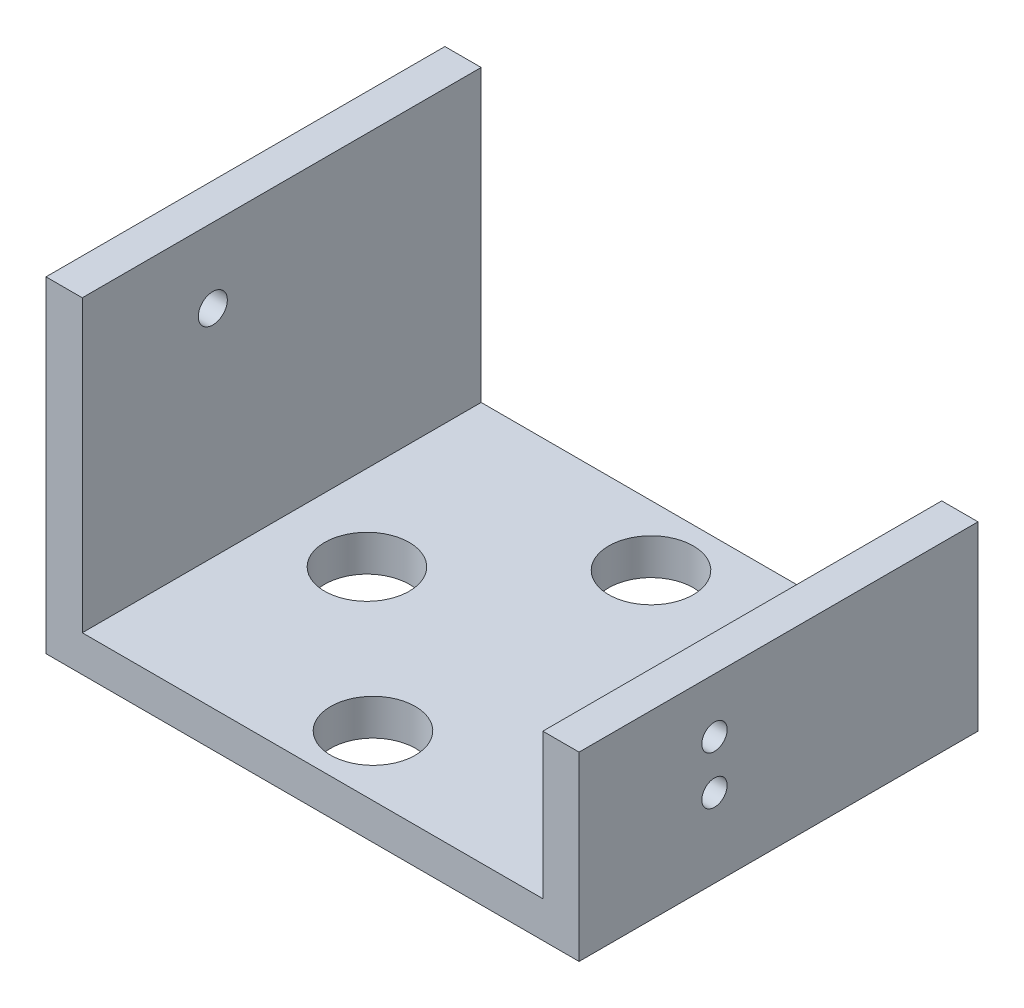
ISO-10303-21;
HEADER;
FILE_DESCRIPTION(('STEP AP214'),'2;1');
FILE_NAME('part.step','',(''),(''),'','','');
FILE_SCHEMA(('AUTOMOTIVE_DESIGN { 1 0 10303 214 1 1 1 1 }'));
ENDSEC;
DATA;
#1=APPLICATION_CONTEXT('core data for automotive mechanical design processes');
#2=APPLICATION_PROTOCOL_DEFINITION('international standard','automotive_design',2000,#1);
#3=PRODUCT_CONTEXT('',#1,'mechanical');
#4=PRODUCT('Part','Part','',(#3));
#5=PRODUCT_RELATED_PRODUCT_CATEGORY('part','',(#4));
#6=PRODUCT_DEFINITION_FORMATION('','',#4);
#7=PRODUCT_DEFINITION_CONTEXT('part definition',#1,'design');
#8=PRODUCT_DEFINITION('design','',#6,#7);
#9=PRODUCT_DEFINITION_SHAPE('','',#8);
#10=(LENGTH_UNIT() NAMED_UNIT(*) SI_UNIT(.MILLI.,.METRE.));
#11=(NAMED_UNIT(*) PLANE_ANGLE_UNIT() SI_UNIT($,.RADIAN.));
#12=(NAMED_UNIT(*) SI_UNIT($,.STERADIAN.) SOLID_ANGLE_UNIT());
#13=UNCERTAINTY_MEASURE_WITH_UNIT(LENGTH_MEASURE(1.E-05),#10,'distance_accuracy_value','');
#14=(GEOMETRIC_REPRESENTATION_CONTEXT(3) GLOBAL_UNCERTAINTY_ASSIGNED_CONTEXT((#13)) GLOBAL_UNIT_ASSIGNED_CONTEXT((#10,
#11,#12)) REPRESENTATION_CONTEXT('',''));
#15=CARTESIAN_POINT('',(0.,0.,0.));
#16=DIRECTION('',(0.,0.,1.));
#17=DIRECTION('',(1.,0.,0.));
#18=AXIS2_PLACEMENT_3D('',#15,#16,#17);
#19=CARTESIAN_POINT('',(0.,3.,0.));
#20=DIRECTION('',(0.,-1.,0.));
#21=DIRECTION('',(0.,0.,-1.));
#22=AXIS2_PLACEMENT_3D('',#19,#20,#21);
#23=PLANE('',#22);
#24=CARTESIAN_POINT('',(-12.,3.,0.));
#25=DIRECTION('',(0.,-1.,0.));
#26=DIRECTION('',(0.,0.,-1.));
#27=AXIS2_PLACEMENT_3D('',#24,#25,#26);
#28=CIRCLE('',#27,3.5);
#29=CARTESIAN_POINT('',(-12.,3.,-3.5));
#30=VERTEX_POINT('',#29);
#31=EDGE_CURVE('E178',#30,#30,#28,.T.);
#32=ORIENTED_EDGE('',*,*,#31,.T.);
#33=EDGE_LOOP('',(#32));
#34=FACE_BOUND('',#33,.T.);
#35=CARTESIAN_POINT('',(0.,3.,-11.5));
#36=DIRECTION('',(0.,-1.,0.));
#37=DIRECTION('',(0.,0.,-1.));
#38=AXIS2_PLACEMENT_3D('',#35,#36,#37);
#39=CIRCLE('',#38,3.5);
#40=CARTESIAN_POINT('',(0.,3.,-15.));
#41=VERTEX_POINT('',#40);
#42=EDGE_CURVE('E273',#41,#41,#39,.T.);
#43=ORIENTED_EDGE('',*,*,#42,.T.);
#44=EDGE_LOOP('',(#43));
#45=FACE_BOUND('',#44,.T.);
#46=CARTESIAN_POINT('',(12.,3.,0.));
#47=DIRECTION('',(0.,-1.,0.));
#48=DIRECTION('',(0.,0.,-1.));
#49=AXIS2_PLACEMENT_3D('',#46,#47,#48);
#50=CIRCLE('',#49,3.5);
#51=CARTESIAN_POINT('',(12.,3.,-3.5));
#52=VERTEX_POINT('',#51);
#53=EDGE_CURVE('E268',#52,#52,#50,.T.);
#54=ORIENTED_EDGE('',*,*,#53,.T.);
#55=EDGE_LOOP('',(#54));
#56=FACE_BOUND('',#55,.T.);
#57=CARTESIAN_POINT('',(0.,3.,11.5));
#58=DIRECTION('',(0.,-1.,0.));
#59=DIRECTION('',(0.,0.,-1.));
#60=AXIS2_PLACEMENT_3D('',#57,#58,#59);
#61=CIRCLE('',#60,3.5);
#62=CARTESIAN_POINT('',(0.,3.,8.));
#63=VERTEX_POINT('',#62);
#64=EDGE_CURVE('E265',#63,#63,#61,.T.);
#65=ORIENTED_EDGE('',*,*,#64,.T.);
#66=EDGE_LOOP('',(#65));
#67=FACE_BOUND('',#66,.T.);
#68=DIRECTION('',(0.,0.,1.));
#69=VECTOR('',#68,1.);
#70=CARTESIAN_POINT('',(19.05,3.,16.5));
#71=LINE('',#70,#69);
#72=CARTESIAN_POINT('',(19.05,3.,-16.5));
#73=VERTEX_POINT('',#72);
#74=CARTESIAN_POINT('',(19.05,3.,16.5));
#75=VERTEX_POINT('',#74);
#76=EDGE_CURVE('E196',#73,#75,#71,.T.);
#77=ORIENTED_EDGE('',*,*,#76,.F.);
#78=DIRECTION('',(-1.,0.,0.));
#79=VECTOR('',#78,1.);
#80=CARTESIAN_POINT('',(-22.05,3.,-16.5));
#81=LINE('',#80,#79);
#82=CARTESIAN_POINT('',(-19.05,3.,-16.5));
#83=VERTEX_POINT('',#82);
#84=EDGE_CURVE('E149',#73,#83,#81,.T.);
#85=ORIENTED_EDGE('',*,*,#84,.T.);
#86=DIRECTION('',(0.,0.,-1.));
#87=VECTOR('',#86,1.);
#88=CARTESIAN_POINT('',(-19.05,3.,-16.5));
#89=LINE('',#88,#87);
#90=CARTESIAN_POINT('',(-19.05,3.,16.5));
#91=VERTEX_POINT('',#90);
#92=EDGE_CURVE('E199',#91,#83,#89,.T.);
#93=ORIENTED_EDGE('',*,*,#92,.F.);
#94=DIRECTION('',(1.,0.,0.));
#95=VECTOR('',#94,1.);
#96=CARTESIAN_POINT('',(-22.05,3.,16.5));
#97=LINE('',#96,#95);
#98=EDGE_CURVE('E139',#91,#75,#97,.T.);
#99=ORIENTED_EDGE('',*,*,#98,.T.);
#100=EDGE_LOOP('',(#77,#85,#93,#99));
#101=FACE_BOUND('',#100,.T.);
#102=ADVANCED_FACE('F49',(#34,#45,#56,#67,#101),#23,.F.);
#103=CARTESIAN_POINT('',(22.05,3.,16.5));
#104=DIRECTION('',(-1.,0.,0.));
#105=DIRECTION('',(0.,0.,1.));
#106=AXIS2_PLACEMENT_3D('',#103,#104,#105);
#107=PLANE('',#106);
#108=CARTESIAN_POINT('',(22.05,10.5,5.3));
#109=DIRECTION('',(1.,0.,0.));
#110=DIRECTION('',(0.,0.,-1.));
#111=AXIS2_PLACEMENT_3D('',#108,#109,#110);
#112=CIRCLE('',#111,1.05);
#113=CARTESIAN_POINT('',(22.05,10.5,4.25));
#114=VERTEX_POINT('',#113);
#115=EDGE_CURVE('E160',#114,#114,#112,.T.);
#116=ORIENTED_EDGE('',*,*,#115,.F.);
#117=EDGE_LOOP('',(#116));
#118=FACE_BOUND('',#117,.T.);
#119=CARTESIAN_POINT('',(22.05,6.5,5.3));
#120=DIRECTION('',(1.,0.,0.));
#121=DIRECTION('',(0.,0.,-1.));
#122=AXIS2_PLACEMENT_3D('',#119,#120,#121);
#123=CIRCLE('',#122,1.05);
#124=CARTESIAN_POINT('',(22.05,6.5,4.25));
#125=VERTEX_POINT('',#124);
#126=EDGE_CURVE('E170',#125,#125,#123,.T.);
#127=ORIENTED_EDGE('',*,*,#126,.F.);
#128=EDGE_LOOP('',(#127));
#129=FACE_BOUND('',#128,.T.);
#130=DIRECTION('',(0.,-1.,0.));
#131=VECTOR('',#130,1.);
#132=CARTESIAN_POINT('',(22.05,3.,-16.5));
#133=LINE('',#132,#131);
#134=CARTESIAN_POINT('',(22.05,15.,-16.5));
#135=VERTEX_POINT('',#134);
#136=CARTESIAN_POINT('',(22.05,0.,-16.5));
#137=VERTEX_POINT('',#136);
#138=EDGE_CURVE('E59',#135,#137,#133,.T.);
#139=ORIENTED_EDGE('',*,*,#138,.F.);
#140=DIRECTION('',(0.,0.,-1.));
#141=VECTOR('',#140,1.);
#142=CARTESIAN_POINT('',(22.05,15.,16.5));
#143=LINE('',#142,#141);
#144=CARTESIAN_POINT('',(22.05,15.,16.5));
#145=VERTEX_POINT('',#144);
#146=EDGE_CURVE('E118',#145,#135,#143,.T.);
#147=ORIENTED_EDGE('',*,*,#146,.F.);
#148=DIRECTION('',(0.,-1.,0.));
#149=VECTOR('',#148,1.);
#150=CARTESIAN_POINT('',(22.05,3.,16.5));
#151=LINE('',#150,#149);
#152=CARTESIAN_POINT('',(22.05,0.,16.5));
#153=VERTEX_POINT('',#152);
#154=EDGE_CURVE('E127',#145,#153,#151,.T.);
#155=ORIENTED_EDGE('',*,*,#154,.T.);
#156=DIRECTION('',(0.,0.,-1.));
#157=VECTOR('',#156,1.);
#158=CARTESIAN_POINT('',(22.05,0.,16.5));
#159=LINE('',#158,#157);
#160=EDGE_CURVE('E225',#153,#137,#159,.T.);
#161=ORIENTED_EDGE('',*,*,#160,.T.);
#162=EDGE_LOOP('',(#139,#147,#155,#161));
#163=FACE_BOUND('',#162,.T.);
#164=ADVANCED_FACE('F51',(#118,#129,#163),#107,.F.);
#165=CARTESIAN_POINT('',(-22.05,3.,-16.5));
#166=DIRECTION('',(0.,0.,1.));
#167=DIRECTION('',(1.,0.,0.));
#168=AXIS2_PLACEMENT_3D('',#165,#166,#167);
#169=PLANE('',#168);
#170=DIRECTION('',(0.,-1.,0.));
#171=VECTOR('',#170,1.);
#172=CARTESIAN_POINT('',(19.05,27.,-16.5));
#173=LINE('',#172,#171);
#174=CARTESIAN_POINT('',(19.05,15.,-16.5));
#175=VERTEX_POINT('',#174);
#176=EDGE_CURVE('E73',#175,#73,#173,.T.);
#177=ORIENTED_EDGE('',*,*,#176,.F.);
#178=DIRECTION('',(1.,0.,0.));
#179=VECTOR('',#178,1.);
#180=CARTESIAN_POINT('',(-1.95,15.,-16.5));
#181=LINE('',#180,#179);
#182=EDGE_CURVE('E67',#175,#135,#181,.T.);
#183=ORIENTED_EDGE('',*,*,#182,.T.);
#184=ORIENTED_EDGE('',*,*,#138,.T.);
#185=DIRECTION('',(-1.,0.,0.));
#186=VECTOR('',#185,1.);
#187=CARTESIAN_POINT('',(-22.05,0.,-16.5));
#188=LINE('',#187,#186);
#189=CARTESIAN_POINT('',(-22.05,0.,-16.5));
#190=VERTEX_POINT('',#189);
#191=EDGE_CURVE('E229',#137,#190,#188,.T.);
#192=ORIENTED_EDGE('',*,*,#191,.T.);
#193=DIRECTION('',(0.,-1.,0.));
#194=VECTOR('',#193,1.);
#195=CARTESIAN_POINT('',(-22.05,3.,-16.5));
#196=LINE('',#195,#194);
#197=CARTESIAN_POINT('',(-22.05,27.,-16.5));
#198=VERTEX_POINT('',#197);
#199=EDGE_CURVE('E145',#198,#190,#196,.T.);
#200=ORIENTED_EDGE('',*,*,#199,.F.);
#201=DIRECTION('',(-1.,0.,0.));
#202=VECTOR('',#201,1.);
#203=CARTESIAN_POINT('',(-22.05,27.,-16.5));
#204=LINE('',#203,#202);
#205=CARTESIAN_POINT('',(-19.05,27.,-16.5));
#206=VERTEX_POINT('',#205);
#207=EDGE_CURVE('E210',#206,#198,#204,.T.);
#208=ORIENTED_EDGE('',*,*,#207,.F.);
#209=DIRECTION('',(0.,-1.,0.));
#210=VECTOR('',#209,1.);
#211=CARTESIAN_POINT('',(-19.05,27.,-16.5));
#212=LINE('',#211,#210);
#213=EDGE_CURVE('E214',#206,#83,#212,.T.);
#214=ORIENTED_EDGE('',*,*,#213,.T.);
#215=ORIENTED_EDGE('',*,*,#84,.F.);
#216=EDGE_LOOP('',(#177,#183,#184,#192,#200,#208,#214,#215));
#217=FACE_BOUND('',#216,.T.);
#218=ADVANCED_FACE('F315',(#217),#169,.F.);
#219=CARTESIAN_POINT('',(-22.05,3.,16.5));
#220=DIRECTION('',(1.,0.,0.));
#221=DIRECTION('',(0.,0.,-1.));
#222=AXIS2_PLACEMENT_3D('',#219,#220,#221);
#223=PLANE('',#222);
#224=CARTESIAN_POINT('',(-22.05,20.85,5.7));
#225=DIRECTION('',(1.,0.,0.));
#226=DIRECTION('',(0.,0.,-1.));
#227=AXIS2_PLACEMENT_3D('',#224,#225,#226);
#228=CIRCLE('',#227,1.2);
#229=CARTESIAN_POINT('',(-22.05,20.85,4.5));
#230=VERTEX_POINT('',#229);
#231=EDGE_CURVE('E130',#230,#230,#228,.T.);
#232=ORIENTED_EDGE('',*,*,#231,.T.);
#233=EDGE_LOOP('',(#232));
#234=FACE_BOUND('',#233,.T.);
#235=DIRECTION('',(0.,0.,1.));
#236=VECTOR('',#235,1.);
#237=CARTESIAN_POINT('',(-22.05,0.,16.5));
#238=LINE('',#237,#236);
#239=CARTESIAN_POINT('',(-22.05,0.,16.5));
#240=VERTEX_POINT('',#239);
#241=EDGE_CURVE('E230',#190,#240,#238,.T.);
#242=ORIENTED_EDGE('',*,*,#241,.T.);
#243=DIRECTION('',(0.,-1.,0.));
#244=VECTOR('',#243,1.);
#245=CARTESIAN_POINT('',(-22.05,3.,16.5));
#246=LINE('',#245,#244);
#247=CARTESIAN_POINT('',(-22.05,27.,16.5));
#248=VERTEX_POINT('',#247);
#249=EDGE_CURVE('E138',#248,#240,#246,.T.);
#250=ORIENTED_EDGE('',*,*,#249,.F.);
#251=DIRECTION('',(0.,0.,1.));
#252=VECTOR('',#251,1.);
#253=CARTESIAN_POINT('',(-22.05,27.,-16.5));
#254=LINE('',#253,#252);
#255=EDGE_CURVE('E200',#198,#248,#254,.T.);
#256=ORIENTED_EDGE('',*,*,#255,.F.);
#257=ORIENTED_EDGE('',*,*,#199,.T.);
#258=EDGE_LOOP('',(#242,#250,#256,#257));
#259=FACE_BOUND('',#258,.T.);
#260=ADVANCED_FACE('F318',(#234,#259),#223,.F.);
#261=CARTESIAN_POINT('',(-22.05,3.,16.5));
#262=DIRECTION('',(0.,0.,-1.));
#263=DIRECTION('',(-1.,0.,0.));
#264=AXIS2_PLACEMENT_3D('',#261,#262,#263);
#265=PLANE('',#264);
#266=ORIENTED_EDGE('',*,*,#154,.F.);
#267=DIRECTION('',(1.,0.,0.));
#268=VECTOR('',#267,1.);
#269=CARTESIAN_POINT('',(-1.95,15.,16.5));
#270=LINE('',#269,#268);
#271=CARTESIAN_POINT('',(19.05,15.,16.5));
#272=VERTEX_POINT('',#271);
#273=EDGE_CURVE('E115',#272,#145,#270,.T.);
#274=ORIENTED_EDGE('',*,*,#273,.F.);
#275=DIRECTION('',(0.,-1.,0.));
#276=VECTOR('',#275,1.);
#277=CARTESIAN_POINT('',(19.05,27.,16.5));
#278=LINE('',#277,#276);
#279=EDGE_CURVE('E193',#272,#75,#278,.T.);
#280=ORIENTED_EDGE('',*,*,#279,.T.);
#281=ORIENTED_EDGE('',*,*,#98,.F.);
#282=DIRECTION('',(0.,-1.,0.));
#283=VECTOR('',#282,1.);
#284=CARTESIAN_POINT('',(-19.05,27.,16.5));
#285=LINE('',#284,#283);
#286=CARTESIAN_POINT('',(-19.05,27.,16.5));
#287=VERTEX_POINT('',#286);
#288=EDGE_CURVE('E221',#287,#91,#285,.T.);
#289=ORIENTED_EDGE('',*,*,#288,.F.);
#290=DIRECTION('',(1.,0.,0.));
#291=VECTOR('',#290,1.);
#292=CARTESIAN_POINT('',(-22.05,27.,16.5));
#293=LINE('',#292,#291);
#294=EDGE_CURVE('E204',#248,#287,#293,.T.);
#295=ORIENTED_EDGE('',*,*,#294,.F.);
#296=ORIENTED_EDGE('',*,*,#249,.T.);
#297=DIRECTION('',(1.,0.,0.));
#298=VECTOR('',#297,1.);
#299=CARTESIAN_POINT('',(-22.05,0.,16.5));
#300=LINE('',#299,#298);
#301=EDGE_CURVE('E135',#240,#153,#300,.T.);
#302=ORIENTED_EDGE('',*,*,#301,.T.);
#303=EDGE_LOOP('',(#266,#274,#280,#281,#289,#295,#296,#302));
#304=FACE_BOUND('',#303,.T.);
#305=ADVANCED_FACE('F132',(#304),#265,.F.);
#306=CARTESIAN_POINT('',(0.,0.,0.));
#307=DIRECTION('',(0.,-1.,0.));
#308=DIRECTION('',(0.,0.,-1.));
#309=AXIS2_PLACEMENT_3D('',#306,#307,#308);
#310=PLANE('',#309);
#311=CARTESIAN_POINT('',(-12.,0.,0.));
#312=DIRECTION('',(0.,-1.,0.));
#313=DIRECTION('',(0.,0.,-1.));
#314=AXIS2_PLACEMENT_3D('',#311,#312,#313);
#315=CIRCLE('',#314,3.5);
#316=CARTESIAN_POINT('',(-12.,0.,-3.5));
#317=VERTEX_POINT('',#316);
#318=EDGE_CURVE('E241',#317,#317,#315,.T.);
#319=ORIENTED_EDGE('',*,*,#318,.F.);
#320=EDGE_LOOP('',(#319));
#321=FACE_BOUND('',#320,.T.);
#322=CARTESIAN_POINT('',(0.,0.,-11.5));
#323=DIRECTION('',(0.,-1.,0.));
#324=DIRECTION('',(0.,0.,-1.));
#325=AXIS2_PLACEMENT_3D('',#322,#323,#324);
#326=CIRCLE('',#325,3.5);
#327=CARTESIAN_POINT('',(0.,0.,-15.));
#328=VERTEX_POINT('',#327);
#329=EDGE_CURVE('E283',#328,#328,#326,.T.);
#330=ORIENTED_EDGE('',*,*,#329,.F.);
#331=EDGE_LOOP('',(#330));
#332=FACE_BOUND('',#331,.T.);
#333=CARTESIAN_POINT('',(12.,0.,0.));
#334=DIRECTION('',(0.,-1.,0.));
#335=DIRECTION('',(0.,0.,-1.));
#336=AXIS2_PLACEMENT_3D('',#333,#334,#335);
#337=CIRCLE('',#336,3.5);
#338=CARTESIAN_POINT('',(12.,0.,-3.5));
#339=VERTEX_POINT('',#338);
#340=EDGE_CURVE('E280',#339,#339,#337,.T.);
#341=ORIENTED_EDGE('',*,*,#340,.F.);
#342=EDGE_LOOP('',(#341));
#343=FACE_BOUND('',#342,.T.);
#344=CARTESIAN_POINT('',(0.,0.,11.5));
#345=DIRECTION('',(0.,-1.,0.));
#346=DIRECTION('',(0.,0.,-1.));
#347=AXIS2_PLACEMENT_3D('',#344,#345,#346);
#348=CIRCLE('',#347,3.5);
#349=CARTESIAN_POINT('',(0.,0.,8.));
#350=VERTEX_POINT('',#349);
#351=EDGE_CURVE('E284',#350,#350,#348,.T.);
#352=ORIENTED_EDGE('',*,*,#351,.F.);
#353=EDGE_LOOP('',(#352));
#354=FACE_BOUND('',#353,.T.);
#355=ORIENTED_EDGE('',*,*,#160,.F.);
#356=ORIENTED_EDGE('',*,*,#301,.F.);
#357=ORIENTED_EDGE('',*,*,#241,.F.);
#358=ORIENTED_EDGE('',*,*,#191,.F.);
#359=EDGE_LOOP('',(#355,#356,#357,#358));
#360=FACE_BOUND('',#359,.T.);
#361=ADVANCED_FACE('F303',(#321,#332,#343,#354,#360),#310,.T.);
#362=CARTESIAN_POINT('',(-19.05,27.,-16.5));
#363=DIRECTION('',(-1.,0.,0.));
#364=DIRECTION('',(0.,0.,1.));
#365=AXIS2_PLACEMENT_3D('',#362,#363,#364);
#366=PLANE('',#365);
#367=CARTESIAN_POINT('',(-19.05,20.85,5.7));
#368=DIRECTION('',(1.,0.,0.));
#369=DIRECTION('',(0.,0.,-1.));
#370=AXIS2_PLACEMENT_3D('',#367,#368,#369);
#371=CIRCLE('',#370,1.2);
#372=CARTESIAN_POINT('',(-19.05,20.85,4.5));
#373=VERTEX_POINT('',#372);
#374=EDGE_CURVE('E168',#373,#373,#371,.T.);
#375=ORIENTED_EDGE('',*,*,#374,.F.);
#376=EDGE_LOOP('',(#375));
#377=FACE_BOUND('',#376,.T.);
#378=ORIENTED_EDGE('',*,*,#92,.T.);
#379=ORIENTED_EDGE('',*,*,#213,.F.);
#380=DIRECTION('',(0.,0.,-1.));
#381=VECTOR('',#380,1.);
#382=CARTESIAN_POINT('',(-19.05,27.,-16.5));
#383=LINE('',#382,#381);
#384=EDGE_CURVE('E207',#287,#206,#383,.T.);
#385=ORIENTED_EDGE('',*,*,#384,.F.);
#386=ORIENTED_EDGE('',*,*,#288,.T.);
#387=EDGE_LOOP('',(#378,#379,#385,#386));
#388=FACE_BOUND('',#387,.T.);
#389=ADVANCED_FACE('F306',(#377,#388),#366,.F.);
#390=CARTESIAN_POINT('',(0.,27.,0.));
#391=DIRECTION('',(0.,1.,0.));
#392=DIRECTION('',(0.,0.,1.));
#393=AXIS2_PLACEMENT_3D('',#390,#391,#392);
#394=PLANE('',#393);
#395=ORIENTED_EDGE('',*,*,#255,.T.);
#396=ORIENTED_EDGE('',*,*,#294,.T.);
#397=ORIENTED_EDGE('',*,*,#384,.T.);
#398=ORIENTED_EDGE('',*,*,#207,.T.);
#399=EDGE_LOOP('',(#395,#396,#397,#398));
#400=FACE_BOUND('',#399,.T.);
#401=ADVANCED_FACE('F321',(#400),#394,.T.);
#402=CARTESIAN_POINT('',(19.05,27.,16.5));
#403=DIRECTION('',(1.,0.,0.));
#404=DIRECTION('',(0.,0.,-1.));
#405=AXIS2_PLACEMENT_3D('',#402,#403,#404);
#406=PLANE('',#405);
#407=CARTESIAN_POINT('',(19.05,10.5,5.3));
#408=DIRECTION('',(1.,0.,0.));
#409=DIRECTION('',(0.,0.,-1.));
#410=AXIS2_PLACEMENT_3D('',#407,#408,#409);
#411=CIRCLE('',#410,1.05);
#412=CARTESIAN_POINT('',(19.05,10.5,4.25));
#413=VERTEX_POINT('',#412);
#414=EDGE_CURVE('E53',#413,#413,#411,.T.);
#415=ORIENTED_EDGE('',*,*,#414,.T.);
#416=EDGE_LOOP('',(#415));
#417=FACE_BOUND('',#416,.T.);
#418=CARTESIAN_POINT('',(19.05,6.5,5.3));
#419=DIRECTION('',(1.,0.,0.));
#420=DIRECTION('',(0.,0.,-1.));
#421=AXIS2_PLACEMENT_3D('',#418,#419,#420);
#422=CIRCLE('',#421,1.05);
#423=CARTESIAN_POINT('',(19.05,6.5,4.25));
#424=VERTEX_POINT('',#423);
#425=EDGE_CURVE('E157',#424,#424,#422,.T.);
#426=ORIENTED_EDGE('',*,*,#425,.T.);
#427=EDGE_LOOP('',(#426));
#428=FACE_BOUND('',#427,.T.);
#429=ORIENTED_EDGE('',*,*,#279,.F.);
#430=DIRECTION('',(0.,0.,-1.));
#431=VECTOR('',#430,1.);
#432=CARTESIAN_POINT('',(19.05,15.,16.5));
#433=LINE('',#432,#431);
#434=EDGE_CURVE('E11',#272,#175,#433,.T.);
#435=ORIENTED_EDGE('',*,*,#434,.T.);
#436=ORIENTED_EDGE('',*,*,#176,.T.);
#437=ORIENTED_EDGE('',*,*,#76,.T.);
#438=EDGE_LOOP('',(#429,#435,#436,#437));
#439=FACE_BOUND('',#438,.T.);
#440=ADVANCED_FACE('F329',(#417,#428,#439),#406,.F.);
#441=CARTESIAN_POINT('',(-1.95,15.,16.5));
#442=DIRECTION('',(0.,-1.,0.));
#443=DIRECTION('',(0.,0.,-1.));
#444=AXIS2_PLACEMENT_3D('',#441,#442,#443);
#445=PLANE('',#444);
#446=ORIENTED_EDGE('',*,*,#273,.T.);
#447=ORIENTED_EDGE('',*,*,#146,.T.);
#448=ORIENTED_EDGE('',*,*,#182,.F.);
#449=ORIENTED_EDGE('',*,*,#434,.F.);
#450=EDGE_LOOP('',(#446,#447,#448,#449));
#451=FACE_BOUND('',#450,.T.);
#452=ADVANCED_FACE('F117',(#451),#445,.F.);
#453=CARTESIAN_POINT('',(-29.05,20.85,5.7));
#454=DIRECTION('',(1.,0.,0.));
#455=DIRECTION('',(0.,0.,-1.));
#456=AXIS2_PLACEMENT_3D('',#453,#454,#455);
#457=CYLINDRICAL_SURFACE('',#456,1.2);
#458=ORIENTED_EDGE('',*,*,#374,.T.);
#459=EDGE_LOOP('',(#458));
#460=FACE_BOUND('',#459,.T.);
#461=ORIENTED_EDGE('',*,*,#231,.F.);
#462=EDGE_LOOP('',(#461));
#463=FACE_BOUND('',#462,.T.);
#464=ADVANCED_FACE('F336',(#460,#463),#457,.F.);
#465=CARTESIAN_POINT('',(12.05,6.5,5.3));
#466=DIRECTION('',(1.,0.,0.));
#467=DIRECTION('',(0.,0.,-1.));
#468=AXIS2_PLACEMENT_3D('',#465,#466,#467);
#469=CYLINDRICAL_SURFACE('',#468,1.05);
#470=ORIENTED_EDGE('',*,*,#126,.T.);
#471=EDGE_LOOP('',(#470));
#472=FACE_BOUND('',#471,.T.);
#473=ORIENTED_EDGE('',*,*,#425,.F.);
#474=EDGE_LOOP('',(#473));
#475=FACE_BOUND('',#474,.T.);
#476=ADVANCED_FACE('F403',(#472,#475),#469,.F.);
#477=CARTESIAN_POINT('',(12.05,10.5,5.3));
#478=DIRECTION('',(1.,0.,0.));
#479=DIRECTION('',(0.,0.,-1.));
#480=AXIS2_PLACEMENT_3D('',#477,#478,#479);
#481=CYLINDRICAL_SURFACE('',#480,1.05);
#482=ORIENTED_EDGE('',*,*,#115,.T.);
#483=EDGE_LOOP('',(#482));
#484=FACE_BOUND('',#483,.T.);
#485=ORIENTED_EDGE('',*,*,#414,.F.);
#486=EDGE_LOOP('',(#485));
#487=FACE_BOUND('',#486,.T.);
#488=ADVANCED_FACE('F413',(#484,#487),#481,.F.);
#489=CARTESIAN_POINT('',(0.,10.,11.5));
#490=DIRECTION('',(0.,-1.,0.));
#491=DIRECTION('',(0.,0.,-1.));
#492=AXIS2_PLACEMENT_3D('',#489,#490,#491);
#493=CYLINDRICAL_SURFACE('',#492,3.5);
#494=ORIENTED_EDGE('',*,*,#351,.T.);
#495=EDGE_LOOP('',(#494));
#496=FACE_BOUND('',#495,.T.);
#497=ORIENTED_EDGE('',*,*,#64,.F.);
#498=EDGE_LOOP('',(#497));
#499=FACE_BOUND('',#498,.T.);
#500=ADVANCED_FACE('F424',(#496,#499),#493,.F.);
#501=CARTESIAN_POINT('',(12.,10.,0.));
#502=DIRECTION('',(0.,-1.,0.));
#503=DIRECTION('',(0.,0.,-1.));
#504=AXIS2_PLACEMENT_3D('',#501,#502,#503);
#505=CYLINDRICAL_SURFACE('',#504,3.5);
#506=ORIENTED_EDGE('',*,*,#340,.T.);
#507=EDGE_LOOP('',(#506));
#508=FACE_BOUND('',#507,.T.);
#509=ORIENTED_EDGE('',*,*,#53,.F.);
#510=EDGE_LOOP('',(#509));
#511=FACE_BOUND('',#510,.T.);
#512=ADVANCED_FACE('F433',(#508,#511),#505,.F.);
#513=CARTESIAN_POINT('',(0.,10.,-11.5));
#514=DIRECTION('',(0.,-1.,0.));
#515=DIRECTION('',(0.,0.,-1.));
#516=AXIS2_PLACEMENT_3D('',#513,#514,#515);
#517=CYLINDRICAL_SURFACE('',#516,3.5);
#518=ORIENTED_EDGE('',*,*,#329,.T.);
#519=EDGE_LOOP('',(#518));
#520=FACE_BOUND('',#519,.T.);
#521=ORIENTED_EDGE('',*,*,#42,.F.);
#522=EDGE_LOOP('',(#521));
#523=FACE_BOUND('',#522,.T.);
#524=ADVANCED_FACE('F444',(#520,#523),#517,.F.);
#525=CARTESIAN_POINT('',(-12.,10.,0.));
#526=DIRECTION('',(0.,-1.,0.));
#527=DIRECTION('',(0.,0.,-1.));
#528=AXIS2_PLACEMENT_3D('',#525,#526,#527);
#529=CYLINDRICAL_SURFACE('',#528,3.5);
#530=ORIENTED_EDGE('',*,*,#318,.T.);
#531=EDGE_LOOP('',(#530));
#532=FACE_BOUND('',#531,.T.);
#533=ORIENTED_EDGE('',*,*,#31,.F.);
#534=EDGE_LOOP('',(#533));
#535=FACE_BOUND('',#534,.T.);
#536=ADVANCED_FACE('F300',(#532,#535),#529,.F.);
#537=CLOSED_SHELL('',(#102,#164,#218,#260,#305,#361,#389,#401,#440,#452,#464,#476,#488,#500,
#512,#524,#536));
#538=MANIFOLD_SOLID_BREP('B2',#537);
#539=ADVANCED_BREP_SHAPE_REPRESENTATION('',(#18,#538),#14);
#540=SHAPE_DEFINITION_REPRESENTATION(#9,#539);
ENDSEC;
END-ISO-10303-21;
